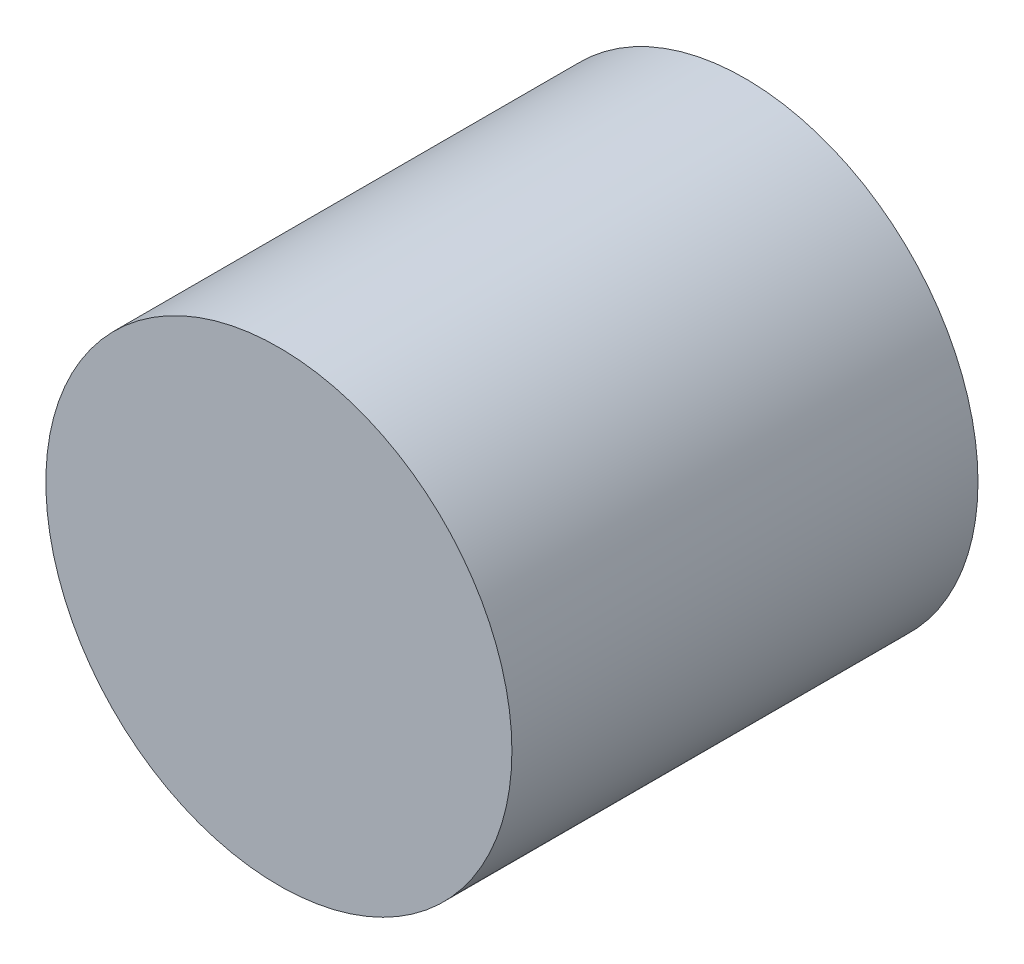
ISO-10303-21;
HEADER;
FILE_DESCRIPTION(('STEP AP214'),'2;1');
FILE_NAME('part.step','',(''),(''),'','','');
FILE_SCHEMA(('AUTOMOTIVE_DESIGN { 1 0 10303 214 1 1 1 1 }'));
ENDSEC;
DATA;
#1=APPLICATION_CONTEXT('core data for automotive mechanical design processes');
#2=APPLICATION_PROTOCOL_DEFINITION('international standard','automotive_design',2000,#1);
#3=PRODUCT_CONTEXT('',#1,'mechanical');
#4=PRODUCT('Part','Part','',(#3));
#5=PRODUCT_RELATED_PRODUCT_CATEGORY('part','',(#4));
#6=PRODUCT_DEFINITION_FORMATION('','',#4);
#7=PRODUCT_DEFINITION_CONTEXT('part definition',#1,'design');
#8=PRODUCT_DEFINITION('design','',#6,#7);
#9=PRODUCT_DEFINITION_SHAPE('','',#8);
#10=(LENGTH_UNIT() NAMED_UNIT(*) SI_UNIT(.MILLI.,.METRE.));
#11=(NAMED_UNIT(*) PLANE_ANGLE_UNIT() SI_UNIT($,.RADIAN.));
#12=(NAMED_UNIT(*) SI_UNIT($,.STERADIAN.) SOLID_ANGLE_UNIT());
#13=UNCERTAINTY_MEASURE_WITH_UNIT(LENGTH_MEASURE(1.E-05),#10,'distance_accuracy_value','');
#14=(GEOMETRIC_REPRESENTATION_CONTEXT(3) GLOBAL_UNCERTAINTY_ASSIGNED_CONTEXT((#13)) GLOBAL_UNIT_ASSIGNED_CONTEXT((#10,
#11,#12)) REPRESENTATION_CONTEXT('',''));
#15=CARTESIAN_POINT('',(0.,0.,0.));
#16=DIRECTION('',(0.,0.,1.));
#17=DIRECTION('',(1.,0.,0.));
#18=AXIS2_PLACEMENT_3D('',#15,#16,#17);
#19=CARTESIAN_POINT('',(0.,0.,15.));
#20=DIRECTION('',(0.,0.,-1.));
#21=DIRECTION('',(-1.,0.,0.));
#22=AXIS2_PLACEMENT_3D('',#19,#20,#21);
#23=CYLINDRICAL_SURFACE('',#22,7.5);
#24=CARTESIAN_POINT('',(0.,0.,15.));
#25=DIRECTION('',(0.,0.,1.));
#26=DIRECTION('',(1.,0.,0.));
#27=AXIS2_PLACEMENT_3D('',#24,#25,#26);
#28=CIRCLE('',#27,7.5);
#29=CARTESIAN_POINT('',(7.5,0.,15.));
#30=VERTEX_POINT('',#29);
#31=EDGE_CURVE('E10',#30,#30,#28,.T.);
#32=ORIENTED_EDGE('',*,*,#31,.F.);
#33=EDGE_LOOP('',(#32));
#34=FACE_BOUND('',#33,.T.);
#35=CARTESIAN_POINT('',(0.,0.,0.));
#36=DIRECTION('',(0.,0.,1.));
#37=DIRECTION('',(1.,0.,0.));
#38=AXIS2_PLACEMENT_3D('',#35,#36,#37);
#39=CIRCLE('',#38,7.5);
#40=CARTESIAN_POINT('',(7.5,0.,0.));
#41=VERTEX_POINT('',#40);
#42=EDGE_CURVE('E34',#41,#41,#39,.T.);
#43=ORIENTED_EDGE('',*,*,#42,.T.);
#44=EDGE_LOOP('',(#43));
#45=FACE_BOUND('',#44,.T.);
#46=ADVANCED_FACE('F31',(#34,#45),#23,.T.);
#47=CARTESIAN_POINT('',(0.,0.,15.));
#48=DIRECTION('',(0.,0.,1.));
#49=DIRECTION('',(1.,0.,0.));
#50=AXIS2_PLACEMENT_3D('',#47,#48,#49);
#51=PLANE('',#50);
#52=ORIENTED_EDGE('',*,*,#31,.T.);
#53=EDGE_LOOP('',(#52));
#54=FACE_BOUND('',#53,.T.);
#55=ADVANCED_FACE('F46',(#54),#51,.T.);
#56=CARTESIAN_POINT('',(0.,0.,0.));
#57=DIRECTION('',(0.,0.,1.));
#58=DIRECTION('',(1.,0.,0.));
#59=AXIS2_PLACEMENT_3D('',#56,#57,#58);
#60=PLANE('',#59);
#61=ORIENTED_EDGE('',*,*,#42,.F.);
#62=EDGE_LOOP('',(#61));
#63=FACE_BOUND('',#62,.T.);
#64=ADVANCED_FACE('F44',(#63),#60,.F.);
#65=CLOSED_SHELL('',(#46,#55,#64));
#66=MANIFOLD_SOLID_BREP('B2',#65);
#67=ADVANCED_BREP_SHAPE_REPRESENTATION('',(#18,#66),#14);
#68=SHAPE_DEFINITION_REPRESENTATION(#9,#67);
ENDSEC;
END-ISO-10303-21;
